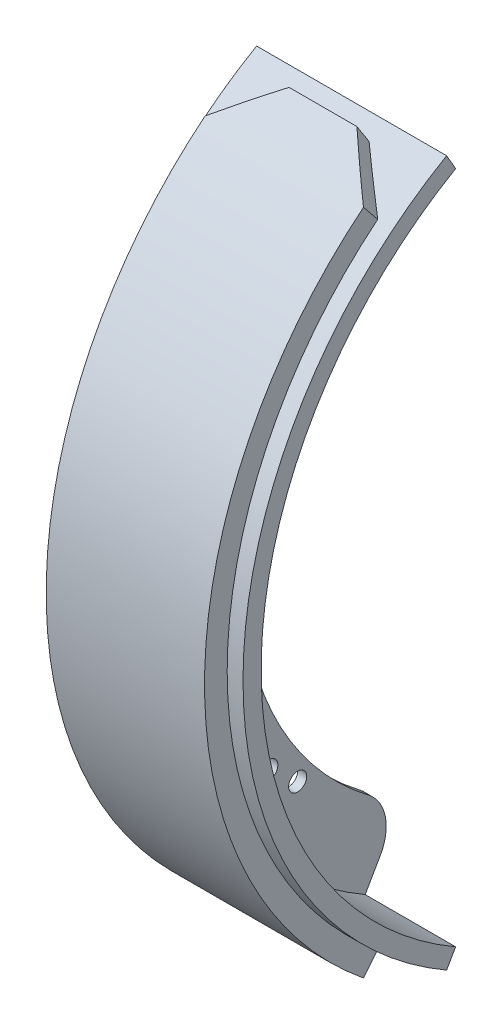
ISO-10303-21;
HEADER;
FILE_DESCRIPTION(('STEP AP214'),'2;1');
FILE_NAME('part.step','',(''),(''),'','','');
FILE_SCHEMA(('AUTOMOTIVE_DESIGN { 1 0 10303 214 1 1 1 1 }'));
ENDSEC;
DATA;
#1=APPLICATION_CONTEXT('core data for automotive mechanical design processes');
#2=APPLICATION_PROTOCOL_DEFINITION('international standard','automotive_design',2000,#1);
#3=PRODUCT_CONTEXT('',#1,'mechanical');
#4=PRODUCT('Part','Part','',(#3));
#5=PRODUCT_RELATED_PRODUCT_CATEGORY('part','',(#4));
#6=PRODUCT_DEFINITION_FORMATION('','',#4);
#7=PRODUCT_DEFINITION_CONTEXT('part definition',#1,'design');
#8=PRODUCT_DEFINITION('design','',#6,#7);
#9=PRODUCT_DEFINITION_SHAPE('','',#8);
#10=(LENGTH_UNIT() NAMED_UNIT(*) SI_UNIT(.MILLI.,.METRE.));
#11=(NAMED_UNIT(*) PLANE_ANGLE_UNIT() SI_UNIT($,.RADIAN.));
#12=(NAMED_UNIT(*) SI_UNIT($,.STERADIAN.) SOLID_ANGLE_UNIT());
#13=UNCERTAINTY_MEASURE_WITH_UNIT(LENGTH_MEASURE(1.E-05),#10,'distance_accuracy_value','');
#14=(GEOMETRIC_REPRESENTATION_CONTEXT(3) GLOBAL_UNCERTAINTY_ASSIGNED_CONTEXT((#13)) GLOBAL_UNIT_ASSIGNED_CONTEXT((#10,
#11,#12)) REPRESENTATION_CONTEXT('',''));
#15=CARTESIAN_POINT('',(0.,0.,0.));
#16=DIRECTION('',(0.,0.,1.));
#17=DIRECTION('',(1.,0.,0.));
#18=AXIS2_PLACEMENT_3D('',#15,#16,#17);
#19=CARTESIAN_POINT('',(1.,0.,0.));
#20=DIRECTION('',(1.,0.,0.));
#21=DIRECTION('',(0.,0.,-1.));
#22=AXIS2_PLACEMENT_3D('',#19,#20,#21);
#23=PLANE('',#22);
#24=CARTESIAN_POINT('',(1.,-40.0261742823472,64.3282642313976));
#25=DIRECTION('',(1.,0.,0.));
#26=DIRECTION('',(0.,0.,1.));
#27=AXIS2_PLACEMENT_3D('',#24,#25,#26);
#28=CIRCLE('',#27,2.02398586325188);
#29=CARTESIAN_POINT('',(1.,-42.0501601455991,64.3282642313976));
#30=VERTEX_POINT('',#29);
#31=CARTESIAN_POINT('',(1.,-38.0021884190953,64.3282642313976));
#32=VERTEX_POINT('',#31);
#33=EDGE_CURVE('E241',#30,#32,#28,.T.);
#34=ORIENTED_EDGE('',*,*,#33,.F.);
#35=DIRECTION('',(0.,0.,-1.));
#36=VECTOR('',#35,1.);
#37=CARTESIAN_POINT('',(1.,-42.0501601455991,70.3282642313976));
#38=LINE('',#37,#36);
#39=CARTESIAN_POINT('',(1.,-42.0501601455991,70.3282642313976));
#40=VERTEX_POINT('',#39);
#41=EDGE_CURVE('E245',#40,#30,#38,.T.);
#42=ORIENTED_EDGE('',*,*,#41,.F.);
#43=CARTESIAN_POINT('',(1.,-40.0261742823472,70.3282642313976));
#44=DIRECTION('',(1.,0.,0.));
#45=DIRECTION('',(0.,0.,-1.));
#46=AXIS2_PLACEMENT_3D('',#43,#44,#45);
#47=CIRCLE('',#46,2.02398586325188);
#48=CARTESIAN_POINT('',(1.,-38.0021884190953,70.3282642313976));
#49=VERTEX_POINT('',#48);
#50=EDGE_CURVE('E225',#49,#40,#47,.T.);
#51=ORIENTED_EDGE('',*,*,#50,.F.);
#52=DIRECTION('',(0.,0.,1.));
#53=VECTOR('',#52,1.);
#54=CARTESIAN_POINT('',(1.,-38.0021884190953,70.3282642313976));
#55=LINE('',#54,#53);
#56=EDGE_CURVE('E236',#32,#49,#55,.T.);
#57=ORIENTED_EDGE('',*,*,#56,.F.);
#58=EDGE_LOOP('',(#34,#42,#51,#57));
#59=FACE_BOUND('',#58,.T.);
#60=CARTESIAN_POINT('',(1.,-45.3747886598545,57.9188348109935));
#61=DIRECTION('',(1.,0.,0.));
#62=DIRECTION('',(0.,0.,-1.));
#63=AXIS2_PLACEMENT_3D('',#60,#61,#62);
#64=CIRCLE('',#63,2.);
#65=CARTESIAN_POINT('',(1.,-45.3747886598545,55.9188348109935));
#66=VERTEX_POINT('',#65);
#67=EDGE_CURVE('E255',#66,#66,#64,.T.);
#68=ORIENTED_EDGE('',*,*,#67,.F.);
#69=EDGE_LOOP('',(#68));
#70=FACE_BOUND('',#69,.T.);
#71=CARTESIAN_POINT('',(1.,67.5512987002253,43.9326505012517));
#72=DIRECTION('',(1.,0.,0.));
#73=DIRECTION('',(0.,0.,-1.));
#74=AXIS2_PLACEMENT_3D('',#71,#72,#73);
#75=CIRCLE('',#74,2.);
#76=CARTESIAN_POINT('',(1.,67.5512987002253,41.9326505012517));
#77=VERTEX_POINT('',#76);
#78=EDGE_CURVE('E258',#77,#77,#75,.T.);
#79=ORIENTED_EDGE('',*,*,#78,.F.);
#80=EDGE_LOOP('',(#79));
#81=FACE_BOUND('',#80,.T.);
#82=DIRECTION('',(0.,0.866025403784441,-0.499999999999995));
#83=VECTOR('',#82,1.);
#84=CARTESIAN_POINT('',(1.,-60.6217782649109,34.9999999999997));
#85=LINE('',#84,#83);
#86=CARTESIAN_POINT('',(1.,-74.4781847254619,42.9999999999996));
#87=VERTEX_POINT('',#86);
#88=CARTESIAN_POINT('',(1.,-68.7386354243378,39.6862696659685));
#89=VERTEX_POINT('',#88);
#90=EDGE_CURVE('E692',#87,#89,#85,.T.);
#91=ORIENTED_EDGE('',*,*,#90,.T.);
#92=CARTESIAN_POINT('',(1.,-63.7386354243379,48.3465237038129));
#93=DIRECTION('',(1.,0.,0.));
#94=DIRECTION('',(0.,0.,-1.));
#95=AXIS2_PLACEMENT_3D('',#92,#93,#94);
#96=CIRCLE('',#95,10.);
#97=CARTESIAN_POINT('',(1.,-55.7713059962956,42.3032082408363));
#98=VERTEX_POINT('',#97);
#99=EDGE_CURVE('E12',#89,#98,#96,.T.);
#100=ORIENTED_EDGE('',*,*,#99,.T.);
#101=CARTESIAN_POINT('',(1.,0.,0.));
#102=DIRECTION('',(-1.,0.,0.));
#103=DIRECTION('',(0.,0.,-1.));
#104=AXIS2_PLACEMENT_3D('',#101,#102,#103);
#105=CIRCLE('',#104,70.);
#106=CARTESIAN_POINT('',(1.,55.7713059962956,42.3032082408363));
#107=VERTEX_POINT('',#106);
#108=EDGE_CURVE('E687',#98,#107,#105,.T.);
#109=ORIENTED_EDGE('',*,*,#108,.T.);
#110=CARTESIAN_POINT('',(1.,63.7386354243378,48.3465237038129));
#111=DIRECTION('',(1.,0.,0.));
#112=DIRECTION('',(0.,0.,-1.));
#113=AXIS2_PLACEMENT_3D('',#110,#111,#112);
#114=CIRCLE('',#113,10.);
#115=CARTESIAN_POINT('',(1.,68.7386354243378,39.6862696659685));
#116=VERTEX_POINT('',#115);
#117=EDGE_CURVE('E780',#107,#116,#114,.T.);
#118=ORIENTED_EDGE('',*,*,#117,.T.);
#119=DIRECTION('',(0.,0.866025403784441,0.499999999999996));
#120=VECTOR('',#119,1.);
#121=CARTESIAN_POINT('',(1.,60.6217782649109,34.9999999999997));
#122=LINE('',#121,#120);
#123=CARTESIAN_POINT('',(1.,74.4781847254619,42.9999999999996));
#124=VERTEX_POINT('',#123);
#125=EDGE_CURVE('E689',#116,#124,#122,.T.);
#126=ORIENTED_EDGE('',*,*,#125,.T.);
#127=CARTESIAN_POINT('',(1.,0.,0.));
#128=DIRECTION('',(1.,0.,0.));
#129=DIRECTION('',(0.,0.,-1.));
#130=AXIS2_PLACEMENT_3D('',#127,#128,#129);
#131=CIRCLE('',#130,86.);
#132=EDGE_CURVE('E684',#124,#87,#131,.T.);
#133=ORIENTED_EDGE('',*,*,#132,.T.);
#134=EDGE_LOOP('',(#91,#100,#109,#118,#126,#133));
#135=FACE_BOUND('',#134,.T.);
#136=ADVANCED_FACE('F71',(#59,#70,#81,#135),#23,.T.);
#137=CARTESIAN_POINT('',(-1.,0.,0.));
#138=DIRECTION('',(1.,0.,0.));
#139=DIRECTION('',(0.,0.,-1.));
#140=AXIS2_PLACEMENT_3D('',#137,#138,#139);
#141=PLANE('',#140);
#142=DIRECTION('',(0.,0.,-1.));
#143=VECTOR('',#142,1.);
#144=CARTESIAN_POINT('',(-1.,-42.0501601455991,0.));
#145=LINE('',#144,#143);
#146=CARTESIAN_POINT('',(-1.,-42.0501601455991,70.3282642313976));
#147=VERTEX_POINT('',#146);
#148=CARTESIAN_POINT('',(-1.,-42.0501601455991,64.3282642313976));
#149=VERTEX_POINT('',#148);
#150=EDGE_CURVE('E765',#147,#149,#145,.T.);
#151=ORIENTED_EDGE('',*,*,#150,.T.);
#152=CARTESIAN_POINT('',(-1.,-40.0261742823472,64.3282642313976));
#153=DIRECTION('',(1.,0.,0.));
#154=DIRECTION('',(0.,0.,-1.));
#155=AXIS2_PLACEMENT_3D('',#152,#153,#154);
#156=CIRCLE('',#155,2.02398586325188);
#157=CARTESIAN_POINT('',(-1.,-38.0021884190953,64.3282642313976));
#158=VERTEX_POINT('',#157);
#159=EDGE_CURVE('E768',#149,#158,#156,.T.);
#160=ORIENTED_EDGE('',*,*,#159,.T.);
#161=DIRECTION('',(0.,0.,1.));
#162=VECTOR('',#161,1.);
#163=CARTESIAN_POINT('',(-1.,-38.0021884190954,0.));
#164=LINE('',#163,#162);
#165=CARTESIAN_POINT('',(-1.,-38.0021884190953,70.3282642313976));
#166=VERTEX_POINT('',#165);
#167=EDGE_CURVE('E703',#158,#166,#164,.T.);
#168=ORIENTED_EDGE('',*,*,#167,.T.);
#169=CARTESIAN_POINT('',(-1.,-40.0261742823472,70.3282642313976));
#170=DIRECTION('',(1.,0.,0.));
#171=DIRECTION('',(0.,0.,-1.));
#172=AXIS2_PLACEMENT_3D('',#169,#170,#171);
#173=CIRCLE('',#172,2.02398586325188);
#174=EDGE_CURVE('E228',#166,#147,#173,.T.);
#175=ORIENTED_EDGE('',*,*,#174,.T.);
#176=EDGE_LOOP('',(#151,#160,#168,#175));
#177=FACE_BOUND('',#176,.T.);
#178=CARTESIAN_POINT('',(-1.,-45.3747886598545,57.9188348109935));
#179=DIRECTION('',(1.,0.,0.));
#180=DIRECTION('',(0.,0.,-1.));
#181=AXIS2_PLACEMENT_3D('',#178,#179,#180);
#182=CIRCLE('',#181,2.);
#183=CARTESIAN_POINT('',(-1.,-45.3747886598545,55.9188348109935));
#184=VERTEX_POINT('',#183);
#185=EDGE_CURVE('E266',#184,#184,#182,.T.);
#186=ORIENTED_EDGE('',*,*,#185,.T.);
#187=EDGE_LOOP('',(#186));
#188=FACE_BOUND('',#187,.T.);
#189=CARTESIAN_POINT('',(-1.,67.5512987002253,43.9326505012517));
#190=DIRECTION('',(1.,0.,0.));
#191=DIRECTION('',(0.,0.,-1.));
#192=AXIS2_PLACEMENT_3D('',#189,#190,#191);
#193=CIRCLE('',#192,2.);
#194=CARTESIAN_POINT('',(-1.,67.5512987002253,41.9326505012517));
#195=VERTEX_POINT('',#194);
#196=EDGE_CURVE('E252',#195,#195,#193,.T.);
#197=ORIENTED_EDGE('',*,*,#196,.T.);
#198=EDGE_LOOP('',(#197));
#199=FACE_BOUND('',#198,.T.);
#200=CARTESIAN_POINT('',(-1.,0.,0.));
#201=DIRECTION('',(-1.,0.,0.));
#202=DIRECTION('',(0.,0.,-1.));
#203=AXIS2_PLACEMENT_3D('',#200,#201,#202);
#204=CIRCLE('',#203,70.);
#205=CARTESIAN_POINT('',(-1.,-55.7713059962956,42.3032082408363));
#206=VERTEX_POINT('',#205);
#207=CARTESIAN_POINT('',(-1.,55.7713059962956,42.3032082408363));
#208=VERTEX_POINT('',#207);
#209=EDGE_CURVE('E686',#206,#208,#204,.T.);
#210=ORIENTED_EDGE('',*,*,#209,.F.);
#211=CARTESIAN_POINT('',(-1.,-63.7386354243379,48.3465237038129));
#212=DIRECTION('',(1.,0.,0.));
#213=DIRECTION('',(0.,0.,-1.));
#214=AXIS2_PLACEMENT_3D('',#211,#212,#213);
#215=CIRCLE('',#214,10.);
#216=CARTESIAN_POINT('',(-1.,-68.7386354243378,39.6862696659685));
#217=VERTEX_POINT('',#216);
#218=EDGE_CURVE('E93',#206,#217,#215,.F.);
#219=ORIENTED_EDGE('',*,*,#218,.T.);
#220=DIRECTION('',(0.,0.866025403784441,-0.499999999999995));
#221=VECTOR('',#220,1.);
#222=CARTESIAN_POINT('',(-1.,-60.6217782649109,34.9999999999997));
#223=LINE('',#222,#221);
#224=CARTESIAN_POINT('',(-0.999999999999994,-74.4781847254619,42.9999999999996));
#225=VERTEX_POINT('',#224);
#226=EDGE_CURVE('E690',#225,#217,#223,.T.);
#227=ORIENTED_EDGE('',*,*,#226,.F.);
#228=CARTESIAN_POINT('',(-1.,0.,0.));
#229=DIRECTION('',(1.,0.,0.));
#230=DIRECTION('',(0.,0.,-1.));
#231=AXIS2_PLACEMENT_3D('',#228,#229,#230);
#232=CIRCLE('',#231,86.);
#233=CARTESIAN_POINT('',(-0.999999999999994,74.4781847254619,42.9999999999997));
#234=VERTEX_POINT('',#233);
#235=EDGE_CURVE('E702',#234,#225,#232,.T.);
#236=ORIENTED_EDGE('',*,*,#235,.F.);
#237=DIRECTION('',(0.,0.866025403784441,0.499999999999996));
#238=VECTOR('',#237,1.);
#239=CARTESIAN_POINT('',(-1.,60.6217782649109,34.9999999999997));
#240=LINE('',#239,#238);
#241=CARTESIAN_POINT('',(-1.,68.7386354243378,39.6862696659685));
#242=VERTEX_POINT('',#241);
#243=EDGE_CURVE('E696',#242,#234,#240,.T.);
#244=ORIENTED_EDGE('',*,*,#243,.F.);
#245=CARTESIAN_POINT('',(-1.,63.7386354243378,48.3465237038129));
#246=DIRECTION('',(1.,0.,0.));
#247=DIRECTION('',(0.,0.,-1.));
#248=AXIS2_PLACEMENT_3D('',#245,#246,#247);
#249=CIRCLE('',#248,10.);
#250=EDGE_CURVE('E774',#242,#208,#249,.F.);
#251=ORIENTED_EDGE('',*,*,#250,.T.);
#252=EDGE_LOOP('',(#210,#219,#227,#236,#244,#251));
#253=FACE_BOUND('',#252,.T.);
#254=ADVANCED_FACE('F791',(#177,#188,#199,#253),#141,.F.);
#255=CARTESIAN_POINT('',(1.,0.,0.));
#256=DIRECTION('',(-1.,0.,0.));
#257=DIRECTION('',(0.,0.,1.));
#258=AXIS2_PLACEMENT_3D('',#255,#256,#257);
#259=CYLINDRICAL_SURFACE('',#258,70.);
#260=ORIENTED_EDGE('',*,*,#108,.F.);
#261=DIRECTION('',(-1.,0.,0.));
#262=VECTOR('',#261,1.);
#263=CARTESIAN_POINT('',(1.,-55.7713059962956,42.3032082408363));
#264=LINE('',#263,#262);
#265=EDGE_CURVE('E782',#98,#206,#264,.T.);
#266=ORIENTED_EDGE('',*,*,#265,.T.);
#267=ORIENTED_EDGE('',*,*,#209,.T.);
#268=DIRECTION('',(-1.,0.,0.));
#269=VECTOR('',#268,1.);
#270=CARTESIAN_POINT('',(1.,55.7713059962956,42.3032082408363));
#271=LINE('',#270,#269);
#272=EDGE_CURVE('E777',#208,#107,#271,.F.);
#273=ORIENTED_EDGE('',*,*,#272,.T.);
#274=EDGE_LOOP('',(#260,#266,#267,#273));
#275=FACE_BOUND('',#274,.T.);
#276=ADVANCED_FACE('F788',(#275),#259,.F.);
#277=CARTESIAN_POINT('',(1.,60.6217782649109,34.9999999999997));
#278=DIRECTION('',(0.,-0.499999999999996,0.866025403784441));
#279=DIRECTION('',(0.,-0.866025403784441,-0.499999999999996));
#280=AXIS2_PLACEMENT_3D('',#277,#278,#279);
#281=PLANE('',#280);
#282=ORIENTED_EDGE('',*,*,#125,.F.);
#283=DIRECTION('',(-1.,0.,0.));
#284=VECTOR('',#283,1.);
#285=CARTESIAN_POINT('',(1.,68.7386354243378,39.6862696659685));
#286=LINE('',#285,#284);
#287=EDGE_CURVE('E771',#116,#242,#286,.T.);
#288=ORIENTED_EDGE('',*,*,#287,.T.);
#289=ORIENTED_EDGE('',*,*,#243,.T.);
#290=DIRECTION('',(-1.,0.,0.));
#291=VECTOR('',#290,1.);
#292=CARTESIAN_POINT('',(21.,74.4781847254619,42.9999999999997));
#293=LINE('',#292,#291);
#294=CARTESIAN_POINT('',(-21.,74.4781847254619,42.9999999999997));
#295=VERTEX_POINT('',#294);
#296=EDGE_CURVE('E680',#234,#295,#293,.T.);
#297=ORIENTED_EDGE('',*,*,#296,.T.);
#298=DIRECTION('',(0.,0.866025403784441,0.499999999999996));
#299=VECTOR('',#298,1.);
#300=CARTESIAN_POINT('',(-21.,74.4781847254619,42.9999999999996));
#301=LINE('',#300,#299);
#302=CARTESIAN_POINT('',(-21.,77.9422863405997,44.9999999999996));
#303=VERTEX_POINT('',#302);
#304=EDGE_CURVE('E672',#295,#303,#301,.T.);
#305=ORIENTED_EDGE('',*,*,#304,.T.);
#306=DIRECTION('',(-1.,0.,0.));
#307=VECTOR('',#306,1.);
#308=CARTESIAN_POINT('',(1.,77.9422863405997,44.9999999999996));
#309=LINE('',#308,#307);
#310=CARTESIAN_POINT('',(21.,77.9422863405997,44.9999999999996));
#311=VERTEX_POINT('',#310);
#312=EDGE_CURVE('E700',#311,#303,#309,.T.);
#313=ORIENTED_EDGE('',*,*,#312,.F.);
#314=DIRECTION('',(0.,0.866025403784441,0.499999999999996));
#315=VECTOR('',#314,1.);
#316=CARTESIAN_POINT('',(21.,74.4781847254619,42.9999999999996));
#317=LINE('',#316,#315);
#318=CARTESIAN_POINT('',(21.,74.4781847254619,42.9999999999997));
#319=VERTEX_POINT('',#318);
#320=EDGE_CURVE('E667',#319,#311,#317,.T.);
#321=ORIENTED_EDGE('',*,*,#320,.F.);
#322=EDGE_CURVE('E676',#319,#124,#293,.T.);
#323=ORIENTED_EDGE('',*,*,#322,.T.);
#324=EDGE_LOOP('',(#282,#288,#289,#297,#305,#313,#321,#323));
#325=FACE_BOUND('',#324,.T.);
#326=ADVANCED_FACE('F719',(#325),#281,.F.);
#327=CARTESIAN_POINT('',(1.,0.,0.));
#328=DIRECTION('',(-1.,0.,0.));
#329=DIRECTION('',(0.,0.,1.));
#330=AXIS2_PLACEMENT_3D('',#327,#328,#329);
#331=CYLINDRICAL_SURFACE('',#330,90.);
#332=CARTESIAN_POINT('',(-7.5,75.7323886327107,48.6272075281326));
#333=CARTESIAN_POINT('',(-10.8333410608964,73.9313767712634,51.4321173133457));
#334=CARTESIAN_POINT('',(-14.1666589391036,71.9743946239595,54.1368421792666));
#335=CARTESIAN_POINT('',(-17.5,69.8734729170595,56.7247545830651));
#336=B_SPLINE_CURVE_WITH_KNOTS('',3,(#332,#333,#334,#335),.UNSPECIFIED.,.F.,.F.,(4,4),(0.,1.),.UNSPECIFIED.);
#337=CARTESIAN_POINT('',(-7.5,75.7323886327107,48.6272075281326));
#338=VERTEX_POINT('',#337);
#339=CARTESIAN_POINT('',(-17.5,69.8734729170595,56.7247545830651));
#340=VERTEX_POINT('',#339);
#341=EDGE_CURVE('E518',#338,#340,#336,.T.);
#342=ORIENTED_EDGE('',*,*,#341,.F.);
#343=DIRECTION('',(-1.,0.,0.));
#344=VECTOR('',#343,1.);
#345=CARTESIAN_POINT('',(7.5,75.7323886327107,48.6272075281326));
#346=LINE('',#345,#344);
#347=CARTESIAN_POINT('',(7.5,75.7323886327107,48.6272075281326));
#348=VERTEX_POINT('',#347);
#349=EDGE_CURVE('E311',#348,#338,#346,.T.);
#350=ORIENTED_EDGE('',*,*,#349,.F.);
#351=CARTESIAN_POINT('',(17.5,69.8734729170595,56.7247545830651));
#352=CARTESIAN_POINT('',(14.1666589391036,71.9743946239595,54.1368421792666));
#353=CARTESIAN_POINT('',(10.8333410608964,73.9313767712634,51.4321173133457));
#354=CARTESIAN_POINT('',(7.5,75.7323886327107,48.6272075281326));
#355=B_SPLINE_CURVE_WITH_KNOTS('',3,(#351,#352,#353,#354),.UNSPECIFIED.,.F.,.F.,(4,4),(0.,1.),.UNSPECIFIED.);
#356=CARTESIAN_POINT('',(17.5,69.8734729170595,56.7247545830651));
#357=VERTEX_POINT('',#356);
#358=EDGE_CURVE('E336',#357,#348,#355,.T.);
#359=ORIENTED_EDGE('',*,*,#358,.F.);
#360=CARTESIAN_POINT('',(17.5,0.,0.));
#361=DIRECTION('',(-1.,0.,0.));
#362=DIRECTION('',(0.,0.776371921300661,0.630275050922945));
#363=AXIS2_PLACEMENT_3D('',#360,#361,#362);
#364=CIRCLE('',#363,90.);
#365=CARTESIAN_POINT('',(17.5,-69.8734729170594,56.7247545830651));
#366=VERTEX_POINT('',#365);
#367=EDGE_CURVE('E552',#366,#357,#364,.T.);
#368=ORIENTED_EDGE('',*,*,#367,.F.);
#369=CARTESIAN_POINT('',(7.5,-75.7323886327107,48.6272075281326));
#370=CARTESIAN_POINT('',(10.8333410608964,-73.9313767712634,51.4321173133457));
#371=CARTESIAN_POINT('',(14.1666589391036,-71.9743946239595,54.1368421792665));
#372=CARTESIAN_POINT('',(17.5,-69.8734729170594,56.7247545830651));
#373=B_SPLINE_CURVE_WITH_KNOTS('',3,(#369,#370,#371,#372),.UNSPECIFIED.,.F.,.F.,(4,4),(0.,1.),.UNSPECIFIED.);
#374=CARTESIAN_POINT('',(7.49999999999999,-75.7323886327107,48.6272075281326));
#375=VERTEX_POINT('',#374);
#376=EDGE_CURVE('E544',#375,#366,#373,.T.);
#377=ORIENTED_EDGE('',*,*,#376,.F.);
#378=DIRECTION('',(1.,0.,0.));
#379=VECTOR('',#378,1.);
#380=CARTESIAN_POINT('',(-7.5,-75.7323886327107,48.6272075281326));
#381=LINE('',#380,#379);
#382=CARTESIAN_POINT('',(-7.5,-75.7323886327107,48.6272075281326));
#383=VERTEX_POINT('',#382);
#384=EDGE_CURVE('E537',#383,#375,#381,.T.);
#385=ORIENTED_EDGE('',*,*,#384,.F.);
#386=CARTESIAN_POINT('',(-17.5,-69.8734729170594,56.7247545830651));
#387=CARTESIAN_POINT('',(-14.1666589391036,-71.9743946239595,54.1368421792666));
#388=CARTESIAN_POINT('',(-10.8333410608964,-73.9313767712634,51.4321173133456));
#389=CARTESIAN_POINT('',(-7.5,-75.7323886327107,48.6272075281326));
#390=B_SPLINE_CURVE_WITH_KNOTS('',3,(#386,#387,#388,#389),.UNSPECIFIED.,.F.,.F.,(4,4),(0.,1.),.UNSPECIFIED.);
#391=CARTESIAN_POINT('',(-17.5,-69.8734729170594,56.7247545830651));
#392=VERTEX_POINT('',#391);
#393=EDGE_CURVE('E531',#392,#383,#390,.T.);
#394=ORIENTED_EDGE('',*,*,#393,.F.);
#395=CARTESIAN_POINT('',(-17.5,0.,0.));
#396=DIRECTION('',(-1.,0.,0.));
#397=DIRECTION('',(0.,0.776371921300661,0.630275050922945));
#398=AXIS2_PLACEMENT_3D('',#395,#396,#397);
#399=CIRCLE('',#398,90.);
#400=EDGE_CURVE('E273',#392,#340,#399,.T.);
#401=ORIENTED_EDGE('',*,*,#400,.T.);
#402=EDGE_LOOP('',(#342,#350,#359,#368,#377,#385,#394,#401));
#403=FACE_BOUND('',#402,.T.);
#404=ORIENTED_EDGE('',*,*,#312,.T.);
#405=CARTESIAN_POINT('',(-21.,0.,0.));
#406=DIRECTION('',(1.,0.,0.));
#407=DIRECTION('',(0.,0.,-1.));
#408=AXIS2_PLACEMENT_3D('',#405,#406,#407);
#409=CIRCLE('',#408,90.);
#410=CARTESIAN_POINT('',(-21.,-77.9422863405997,44.9999999999996));
#411=VERTEX_POINT('',#410);
#412=EDGE_CURVE('E658',#303,#411,#409,.T.);
#413=ORIENTED_EDGE('',*,*,#412,.T.);
#414=DIRECTION('',(-1.,0.,0.));
#415=VECTOR('',#414,1.);
#416=CARTESIAN_POINT('',(1.,-77.9422863405997,44.9999999999996));
#417=LINE('',#416,#415);
#418=CARTESIAN_POINT('',(21.,-77.9422863405997,44.9999999999996));
#419=VERTEX_POINT('',#418);
#420=EDGE_CURVE('E694',#419,#411,#417,.T.);
#421=ORIENTED_EDGE('',*,*,#420,.F.);
#422=CARTESIAN_POINT('',(21.,0.,0.));
#423=DIRECTION('',(1.,0.,0.));
#424=DIRECTION('',(0.,0.,-1.));
#425=AXIS2_PLACEMENT_3D('',#422,#423,#424);
#426=CIRCLE('',#425,90.);
#427=EDGE_CURVE('E675',#311,#419,#426,.T.);
#428=ORIENTED_EDGE('',*,*,#427,.F.);
#429=EDGE_LOOP('',(#404,#413,#421,#428));
#430=FACE_BOUND('',#429,.T.);
#431=ADVANCED_FACE('F540',(#403,#430),#331,.T.);
#432=CARTESIAN_POINT('',(1.,-60.6217782649109,34.9999999999997));
#433=DIRECTION('',(0.,0.499999999999995,0.866025403784441));
#434=DIRECTION('',(0.,-0.866025403784441,0.499999999999995));
#435=AXIS2_PLACEMENT_3D('',#432,#433,#434);
#436=PLANE('',#435);
#437=ORIENTED_EDGE('',*,*,#226,.T.);
#438=DIRECTION('',(-1.,0.,0.));
#439=VECTOR('',#438,1.);
#440=CARTESIAN_POINT('',(1.,-68.7386354243378,39.6862696659685));
#441=LINE('',#440,#439);
#442=EDGE_CURVE('E79',#217,#89,#441,.F.);
#443=ORIENTED_EDGE('',*,*,#442,.T.);
#444=ORIENTED_EDGE('',*,*,#90,.F.);
#445=DIRECTION('',(-1.,0.,0.));
#446=VECTOR('',#445,1.);
#447=CARTESIAN_POINT('',(21.,-74.4781847254619,42.9999999999996));
#448=LINE('',#447,#446);
#449=CARTESIAN_POINT('',(21.,-74.4781847254619,42.9999999999996));
#450=VERTEX_POINT('',#449);
#451=EDGE_CURVE('E681',#450,#87,#448,.T.);
#452=ORIENTED_EDGE('',*,*,#451,.F.);
#453=DIRECTION('',(0.,0.866025403784442,-0.499999999999993));
#454=VECTOR('',#453,1.);
#455=CARTESIAN_POINT('',(21.,-77.9422863405997,44.9999999999996));
#456=LINE('',#455,#454);
#457=EDGE_CURVE('E812',#419,#450,#456,.T.);
#458=ORIENTED_EDGE('',*,*,#457,.F.);
#459=ORIENTED_EDGE('',*,*,#420,.T.);
#460=DIRECTION('',(0.,0.866025403784442,-0.499999999999993));
#461=VECTOR('',#460,1.);
#462=CARTESIAN_POINT('',(-21.,-77.9422863405997,44.9999999999996));
#463=LINE('',#462,#461);
#464=CARTESIAN_POINT('',(-21.,-74.4781847254619,42.9999999999996));
#465=VERTEX_POINT('',#464);
#466=EDGE_CURVE('E660',#411,#465,#463,.T.);
#467=ORIENTED_EDGE('',*,*,#466,.T.);
#468=EDGE_CURVE('E679',#225,#465,#448,.T.);
#469=ORIENTED_EDGE('',*,*,#468,.F.);
#470=EDGE_LOOP('',(#437,#443,#444,#452,#458,#459,#467,#469));
#471=FACE_BOUND('',#470,.T.);
#472=ADVANCED_FACE('F718',(#471),#436,.F.);
#473=CARTESIAN_POINT('',(-21.,0.,0.));
#474=DIRECTION('',(1.,0.,0.));
#475=DIRECTION('',(0.,0.,-1.));
#476=AXIS2_PLACEMENT_3D('',#473,#474,#475);
#477=PLANE('',#476);
#478=ORIENTED_EDGE('',*,*,#412,.F.);
#479=ORIENTED_EDGE('',*,*,#304,.F.);
#480=CARTESIAN_POINT('',(-21.,0.,0.));
#481=DIRECTION('',(-1.,0.,0.));
#482=DIRECTION('',(0.,0.,-1.));
#483=AXIS2_PLACEMENT_3D('',#480,#481,#482);
#484=CIRCLE('',#483,86.);
#485=EDGE_CURVE('E664',#465,#295,#484,.T.);
#486=ORIENTED_EDGE('',*,*,#485,.F.);
#487=ORIENTED_EDGE('',*,*,#466,.F.);
#488=EDGE_LOOP('',(#478,#479,#486,#487));
#489=FACE_BOUND('',#488,.T.);
#490=ADVANCED_FACE('F828',(#489),#477,.F.);
#491=CARTESIAN_POINT('',(21.,0.,0.));
#492=DIRECTION('',(-1.,0.,0.));
#493=DIRECTION('',(0.,0.,1.));
#494=AXIS2_PLACEMENT_3D('',#491,#492,#493);
#495=CYLINDRICAL_SURFACE('',#494,86.);
#496=ORIENTED_EDGE('',*,*,#296,.F.);
#497=ORIENTED_EDGE('',*,*,#235,.T.);
#498=ORIENTED_EDGE('',*,*,#468,.T.);
#499=ORIENTED_EDGE('',*,*,#485,.T.);
#500=EDGE_LOOP('',(#496,#497,#498,#499));
#501=FACE_BOUND('',#500,.T.);
#502=ADVANCED_FACE('F825',(#501),#495,.F.);
#503=ORIENTED_EDGE('',*,*,#132,.F.);
#504=ORIENTED_EDGE('',*,*,#322,.F.);
#505=CARTESIAN_POINT('',(21.,0.,0.));
#506=DIRECTION('',(-1.,0.,0.));
#507=DIRECTION('',(0.,0.,-1.));
#508=AXIS2_PLACEMENT_3D('',#505,#506,#507);
#509=CIRCLE('',#508,86.);
#510=EDGE_CURVE('E809',#450,#319,#509,.T.);
#511=ORIENTED_EDGE('',*,*,#510,.F.);
#512=ORIENTED_EDGE('',*,*,#451,.T.);
#513=EDGE_LOOP('',(#503,#504,#511,#512));
#514=FACE_BOUND('',#513,.T.);
#515=ADVANCED_FACE('F808',(#514),#495,.F.);
#516=CARTESIAN_POINT('',(21.,0.,0.));
#517=DIRECTION('',(1.,0.,0.));
#518=DIRECTION('',(0.,0.,-1.));
#519=AXIS2_PLACEMENT_3D('',#516,#517,#518);
#520=PLANE('',#519);
#521=ORIENTED_EDGE('',*,*,#427,.T.);
#522=ORIENTED_EDGE('',*,*,#457,.T.);
#523=ORIENTED_EDGE('',*,*,#510,.T.);
#524=ORIENTED_EDGE('',*,*,#320,.T.);
#525=EDGE_LOOP('',(#521,#522,#523,#524));
#526=FACE_BOUND('',#525,.T.);
#527=ADVANCED_FACE('F435',(#526),#520,.T.);
#528=CARTESIAN_POINT('',(0.,75.7323886327107,48.6272075281326));
#529=DIRECTION('',(0.,0.54030230586814,-0.841470984807896));
#530=DIRECTION('',(-1.,0.,0.));
#531=AXIS2_PLACEMENT_3D('',#528,#529,#530);
#532=PLANE('',#531);
#533=CARTESIAN_POINT('',(-7.5,79.9397435567502,51.3287190574733));
#534=CARTESIAN_POINT('',(-7.5,75.7323886327107,48.6272075281326));
#535=B_SPLINE_CURVE_WITH_KNOTS('',1,(#533,#534),.UNSPECIFIED.,.F.,.F.,(2,2),(0.,1.),.UNSPECIFIED.);
#536=CARTESIAN_POINT('',(-7.5,79.9397435567502,51.3287190574733));
#537=VERTEX_POINT('',#536);
#538=EDGE_CURVE('E419',#537,#338,#535,.T.);
#539=ORIENTED_EDGE('',*,*,#538,.F.);
#540=DIRECTION('',(-1.,0.,0.));
#541=VECTOR('',#540,1.);
#542=CARTESIAN_POINT('',(1.,79.9397435567502,51.3287190574733));
#543=LINE('',#542,#541);
#544=CARTESIAN_POINT('',(7.5,79.9397435567502,51.3287190574733));
#545=VERTEX_POINT('',#544);
#546=EDGE_CURVE('E327',#545,#537,#543,.T.);
#547=ORIENTED_EDGE('',*,*,#546,.F.);
#548=CARTESIAN_POINT('',(7.5,75.7323886327107,48.6272075281326));
#549=CARTESIAN_POINT('',(7.5,79.9397435567502,51.3287190574733));
#550=B_SPLINE_CURVE_WITH_KNOTS('',1,(#548,#549),.UNSPECIFIED.,.F.,.F.,(2,2),(0.,1.),.UNSPECIFIED.);
#551=EDGE_CURVE('E397',#545,#348,#550,.F.);
#552=ORIENTED_EDGE('',*,*,#551,.T.);
#553=ORIENTED_EDGE('',*,*,#349,.T.);
#554=EDGE_LOOP('',(#539,#547,#552,#553));
#555=FACE_BOUND('',#554,.T.);
#556=ADVANCED_FACE('F356',(#555),#532,.T.);
#557=CARTESIAN_POINT('',(17.5,73.7553325235628,59.8761298376798));
#558=CARTESIAN_POINT('',(14.166658525755,75.9729723780652,57.1444441838184));
#559=CARTESIAN_POINT('',(10.833341474245,78.0386752450374,54.2894575312313));
#560=CARTESIAN_POINT('',(7.5,79.9397435567502,51.3287190574733));
#561=CARTESIAN_POINT('',(17.5,69.8734729170595,56.7247545830651));
#562=CARTESIAN_POINT('',(14.1666589391036,71.9743946239595,54.1368421792666));
#563=CARTESIAN_POINT('',(10.8333410608964,73.9313767712634,51.4321173133457));
#564=CARTESIAN_POINT('',(7.5,75.7323886327107,48.6272075281326));
#565=B_SPLINE_SURFACE_WITH_KNOTS('',1,3,((#557,#558,#559,#560),(#561,#562,#563,#564)),
.UNSPECIFIED.,.F.,.F.,.F.,(2,2),(4,4),(0.,1.),(0.,1.),.UNSPECIFIED.);
#566=CARTESIAN_POINT('',(7.5,79.9397435567502,51.3287190574733));
#567=CARTESIAN_POINT('',(10.833341474245,78.0386752450374,54.2894575312313));
#568=CARTESIAN_POINT('',(14.166658525755,75.9729723780652,57.1444441838184));
#569=CARTESIAN_POINT('',(17.5,73.7553325235628,59.8761298376798));
#570=B_SPLINE_CURVE_WITH_KNOTS('',3,(#566,#567,#568,#569),.UNSPECIFIED.,.F.,.F.,(4,4),(0.,1.),.UNSPECIFIED.);
#571=CARTESIAN_POINT('',(17.5,73.7553325235628,59.8761298376798));
#572=VERTEX_POINT('',#571);
#573=EDGE_CURVE('E324',#572,#545,#570,.F.);
#574=CARTESIAN_POINT('',(17.5,73.7553325235628,59.8761298376798));
#575=CARTESIAN_POINT('',(17.5,69.8734729170595,56.7247545830651));
#576=B_SPLINE_CURVE_WITH_KNOTS('',1,(#574,#575),.UNSPECIFIED.,.F.,.F.,(2,2),(0.,1.),.UNSPECIFIED.);
#577=EDGE_CURVE('E386',#572,#357,#576,.T.);
#578=ORIENTED_EDGE('',*,*,#551,.F.);
#579=ORIENTED_EDGE('',*,*,#573,.F.);
#580=ORIENTED_EDGE('',*,*,#577,.T.);
#581=ORIENTED_EDGE('',*,*,#358,.T.);
#582=EDGE_LOOP('',(#578,#579,#580,#581));
#583=FACE_BOUND('',#582,.T.);
#584=ADVANCED_FACE('F343',(#583),#565,.T.);
#585=CARTESIAN_POINT('',(17.5,0.,0.));
#586=DIRECTION('',(1.,0.,0.));
#587=DIRECTION('',(0.,0.,-1.));
#588=AXIS2_PLACEMENT_3D('',#585,#586,#587);
#589=PLANE('',#588);
#590=ORIENTED_EDGE('',*,*,#577,.F.);
#591=CARTESIAN_POINT('',(17.5,0.,0.));
#592=DIRECTION('',(-1.,0.,0.));
#593=DIRECTION('',(0.,0.,1.));
#594=AXIS2_PLACEMENT_3D('',#591,#592,#593);
#595=CIRCLE('',#594,95.);
#596=CARTESIAN_POINT('',(17.5,-73.7553325235627,59.8761298376798));
#597=VERTEX_POINT('',#596);
#598=EDGE_CURVE('E526',#597,#572,#595,.T.);
#599=ORIENTED_EDGE('',*,*,#598,.F.);
#600=CARTESIAN_POINT('',(17.5,-69.8734729170594,56.7247545830651));
#601=CARTESIAN_POINT('',(17.5,-73.7553325235627,59.8761298376798));
#602=B_SPLINE_CURVE_WITH_KNOTS('',1,(#600,#601),.UNSPECIFIED.,.F.,.F.,(2,2),(0.,1.),.UNSPECIFIED.);
#603=EDGE_CURVE('E612',#597,#366,#602,.F.);
#604=ORIENTED_EDGE('',*,*,#603,.T.);
#605=ORIENTED_EDGE('',*,*,#367,.T.);
#606=EDGE_LOOP('',(#590,#599,#604,#605));
#607=FACE_BOUND('',#606,.T.);
#608=ADVANCED_FACE('F355',(#607),#589,.T.);
#609=CARTESIAN_POINT('',(7.5,-79.9397435567502,51.3287190574733));
#610=CARTESIAN_POINT('',(10.833341474245,-78.0386752450375,54.2894575312313));
#611=CARTESIAN_POINT('',(14.166658525755,-75.9729723780652,57.1444441838184));
#612=CARTESIAN_POINT('',(17.5,-73.7553325235627,59.8761298376798));
#613=CARTESIAN_POINT('',(7.5,-75.7323886327107,48.6272075281326));
#614=CARTESIAN_POINT('',(10.8333410608964,-73.9313767712634,51.4321173133457));
#615=CARTESIAN_POINT('',(14.1666589391036,-71.9743946239595,54.1368421792665));
#616=CARTESIAN_POINT('',(17.5,-69.8734729170594,56.7247545830651));
#617=B_SPLINE_SURFACE_WITH_KNOTS('',1,3,((#609,#610,#611,#612),(#613,#614,#615,#616)),
.UNSPECIFIED.,.F.,.F.,.F.,(2,2),(4,4),(0.,1.),(0.,1.),.UNSPECIFIED.);
#618=CARTESIAN_POINT('',(17.5,-73.7553325235627,59.8761298376798));
#619=CARTESIAN_POINT('',(14.166658525755,-75.9729723780652,57.1444441838184));
#620=CARTESIAN_POINT('',(10.833341474245,-78.0386752450375,54.2894575312313));
#621=CARTESIAN_POINT('',(7.5,-79.9397435567502,51.3287190574733));
#622=B_SPLINE_CURVE_WITH_KNOTS('',3,(#618,#619,#620,#621),.UNSPECIFIED.,.F.,.F.,(4,4),(0.,1.),.UNSPECIFIED.);
#623=CARTESIAN_POINT('',(7.5,-79.9397435567502,51.3287190574733));
#624=VERTEX_POINT('',#623);
#625=EDGE_CURVE('E519',#624,#597,#622,.F.);
#626=CARTESIAN_POINT('',(7.5,-79.9397435567502,51.3287190574733));
#627=CARTESIAN_POINT('',(7.5,-75.7323886327107,48.6272075281326));
#628=B_SPLINE_CURVE_WITH_KNOTS('',1,(#626,#627),.UNSPECIFIED.,.F.,.F.,(2,2),(0.,1.),.UNSPECIFIED.);
#629=EDGE_CURVE('E602',#624,#375,#628,.T.);
#630=ORIENTED_EDGE('',*,*,#603,.F.);
#631=ORIENTED_EDGE('',*,*,#625,.F.);
#632=ORIENTED_EDGE('',*,*,#629,.T.);
#633=ORIENTED_EDGE('',*,*,#376,.T.);
#634=EDGE_LOOP('',(#630,#631,#632,#633));
#635=FACE_BOUND('',#634,.T.);
#636=ADVANCED_FACE('F573',(#635),#617,.T.);
#637=CARTESIAN_POINT('',(0.,-75.7323886327107,48.6272075281326));
#638=DIRECTION('',(0.,-0.54030230586814,-0.841470984807897));
#639=DIRECTION('',(1.,0.,0.));
#640=AXIS2_PLACEMENT_3D('',#637,#638,#639);
#641=PLANE('',#640);
#642=ORIENTED_EDGE('',*,*,#629,.F.);
#643=DIRECTION('',(-1.,0.,0.));
#644=VECTOR('',#643,1.);
#645=CARTESIAN_POINT('',(1.,-79.9397435567502,51.3287190574733));
#646=LINE('',#645,#644);
#647=CARTESIAN_POINT('',(-7.5,-79.9397435567502,51.3287190574733));
#648=VERTEX_POINT('',#647);
#649=EDGE_CURVE('E512',#648,#624,#646,.F.);
#650=ORIENTED_EDGE('',*,*,#649,.F.);
#651=CARTESIAN_POINT('',(-7.5,-75.7323886327107,48.6272075281326));
#652=CARTESIAN_POINT('',(-7.5,-79.9397435567502,51.3287190574733));
#653=B_SPLINE_CURVE_WITH_KNOTS('',1,(#651,#652),.UNSPECIFIED.,.F.,.F.,(2,2),(0.,1.),.UNSPECIFIED.);
#654=EDGE_CURVE('E506',#648,#383,#653,.F.);
#655=ORIENTED_EDGE('',*,*,#654,.T.);
#656=ORIENTED_EDGE('',*,*,#384,.T.);
#657=EDGE_LOOP('',(#642,#650,#655,#656));
#658=FACE_BOUND('',#657,.T.);
#659=ADVANCED_FACE('F481',(#658),#641,.T.);
#660=CARTESIAN_POINT('',(-17.5,-73.7553325235627,59.8761298376798));
#661=CARTESIAN_POINT('',(-14.166658525755,-75.9729723780652,57.1444441838184));
#662=CARTESIAN_POINT('',(-10.833341474245,-78.0386752450375,54.2894575312313));
#663=CARTESIAN_POINT('',(-7.5,-79.9397435567502,51.3287190574733));
#664=CARTESIAN_POINT('',(-17.5,-69.8734729170594,56.7247545830651));
#665=CARTESIAN_POINT('',(-14.1666589391036,-71.9743946239595,54.1368421792666));
#666=CARTESIAN_POINT('',(-10.8333410608964,-73.9313767712634,51.4321173133456));
#667=CARTESIAN_POINT('',(-7.5,-75.7323886327107,48.6272075281326));
#668=B_SPLINE_SURFACE_WITH_KNOTS('',1,3,((#660,#661,#662,#663),(#664,#665,#666,#667)),
.UNSPECIFIED.,.F.,.F.,.F.,(2,2),(4,4),(0.,1.),(0.,1.),.UNSPECIFIED.);
#669=CARTESIAN_POINT('',(-7.5,-79.9397435567502,51.3287190574733));
#670=CARTESIAN_POINT('',(-10.833341474245,-78.0386752450375,54.2894575312313));
#671=CARTESIAN_POINT('',(-14.166658525755,-75.9729723780652,57.1444441838184));
#672=CARTESIAN_POINT('',(-17.5,-73.7553325235627,59.8761298376798));
#673=B_SPLINE_CURVE_WITH_KNOTS('',3,(#669,#670,#671,#672),.UNSPECIFIED.,.F.,.F.,(4,4),(0.,1.),.UNSPECIFIED.);
#674=CARTESIAN_POINT('',(-17.5,-73.7553325235627,59.8761298376798));
#675=VERTEX_POINT('',#674);
#676=EDGE_CURVE('E505',#675,#648,#673,.F.);
#677=CARTESIAN_POINT('',(-17.5,-73.7553325235627,59.8761298376798));
#678=CARTESIAN_POINT('',(-17.5,-69.8734729170594,56.7247545830651));
#679=B_SPLINE_CURVE_WITH_KNOTS('',1,(#677,#678),.UNSPECIFIED.,.F.,.F.,(2,2),(0.,1.),.UNSPECIFIED.);
#680=EDGE_CURVE('E464',#675,#392,#679,.T.);
#681=ORIENTED_EDGE('',*,*,#654,.F.);
#682=ORIENTED_EDGE('',*,*,#676,.F.);
#683=ORIENTED_EDGE('',*,*,#680,.T.);
#684=ORIENTED_EDGE('',*,*,#393,.T.);
#685=EDGE_LOOP('',(#681,#682,#683,#684));
#686=FACE_BOUND('',#685,.T.);
#687=ADVANCED_FACE('F470',(#686),#668,.T.);
#688=CARTESIAN_POINT('',(-17.5,0.,0.));
#689=DIRECTION('',(1.,0.,0.));
#690=DIRECTION('',(0.,0.,-1.));
#691=AXIS2_PLACEMENT_3D('',#688,#689,#690);
#692=PLANE('',#691);
#693=ORIENTED_EDGE('',*,*,#680,.F.);
#694=CARTESIAN_POINT('',(-17.5,0.,0.));
#695=DIRECTION('',(-1.,0.,0.));
#696=DIRECTION('',(0.,0.,1.));
#697=AXIS2_PLACEMENT_3D('',#694,#695,#696);
#698=CIRCLE('',#697,95.);
#699=CARTESIAN_POINT('',(-17.5,73.7553325235628,59.8761298376798));
#700=VERTEX_POINT('',#699);
#701=EDGE_CURVE('E261',#675,#700,#698,.T.);
#702=ORIENTED_EDGE('',*,*,#701,.T.);
#703=CARTESIAN_POINT('',(-17.5,69.8734729170595,56.7247545830651));
#704=CARTESIAN_POINT('',(-17.5,73.7553325235628,59.8761298376798));
#705=B_SPLINE_CURVE_WITH_KNOTS('',1,(#703,#704),.UNSPECIFIED.,.F.,.F.,(2,2),(0.,1.),.UNSPECIFIED.);
#706=EDGE_CURVE('E536',#700,#340,#705,.F.);
#707=ORIENTED_EDGE('',*,*,#706,.T.);
#708=ORIENTED_EDGE('',*,*,#400,.F.);
#709=EDGE_LOOP('',(#693,#702,#707,#708));
#710=FACE_BOUND('',#709,.T.);
#711=ADVANCED_FACE('F290',(#710),#692,.F.);
#712=CARTESIAN_POINT('',(-7.5,79.9397435567502,51.3287190574733));
#713=CARTESIAN_POINT('',(-10.833341474245,78.0386752450375,54.2894575312313));
#714=CARTESIAN_POINT('',(-14.166658525755,75.9729723780652,57.1444441838184));
#715=CARTESIAN_POINT('',(-17.5,73.7553325235628,59.8761298376798));
#716=CARTESIAN_POINT('',(-7.5,75.7323886327107,48.6272075281326));
#717=CARTESIAN_POINT('',(-10.8333410608964,73.9313767712634,51.4321173133457));
#718=CARTESIAN_POINT('',(-14.1666589391036,71.9743946239595,54.1368421792666));
#719=CARTESIAN_POINT('',(-17.5,69.8734729170595,56.7247545830651));
#720=B_SPLINE_SURFACE_WITH_KNOTS('',1,3,((#712,#713,#714,#715),(#716,#717,#718,#719)),
.UNSPECIFIED.,.F.,.F.,.F.,(2,2),(4,4),(0.,1.),(0.,1.),.UNSPECIFIED.);
#721=CARTESIAN_POINT('',(-17.5,73.7553325235628,59.8761298376798));
#722=CARTESIAN_POINT('',(-14.166658525755,75.9729723780652,57.1444441838184));
#723=CARTESIAN_POINT('',(-10.833341474245,78.0386752450375,54.2894575312313));
#724=CARTESIAN_POINT('',(-7.5,79.9397435567502,51.3287190574733));
#725=B_SPLINE_CURVE_WITH_KNOTS('',3,(#721,#722,#723,#724),.UNSPECIFIED.,.F.,.F.,(4,4),(0.,1.),.UNSPECIFIED.);
#726=EDGE_CURVE('E265',#537,#700,#725,.F.);
#727=ORIENTED_EDGE('',*,*,#726,.F.);
#728=ORIENTED_EDGE('',*,*,#538,.T.);
#729=ORIENTED_EDGE('',*,*,#341,.T.);
#730=ORIENTED_EDGE('',*,*,#706,.F.);
#731=EDGE_LOOP('',(#727,#728,#729,#730));
#732=FACE_BOUND('',#731,.T.);
#733=ADVANCED_FACE('F287',(#732),#720,.T.);
#734=CARTESIAN_POINT('',(1.,0.,0.));
#735=DIRECTION('',(-1.,0.,0.));
#736=DIRECTION('',(0.,0.,1.));
#737=AXIS2_PLACEMENT_3D('',#734,#735,#736);
#738=CYLINDRICAL_SURFACE('',#737,95.);
#739=ORIENTED_EDGE('',*,*,#701,.F.);
#740=ORIENTED_EDGE('',*,*,#676,.T.);
#741=ORIENTED_EDGE('',*,*,#649,.T.);
#742=ORIENTED_EDGE('',*,*,#625,.T.);
#743=ORIENTED_EDGE('',*,*,#598,.T.);
#744=ORIENTED_EDGE('',*,*,#573,.T.);
#745=ORIENTED_EDGE('',*,*,#546,.T.);
#746=ORIENTED_EDGE('',*,*,#726,.T.);
#747=EDGE_LOOP('',(#739,#740,#741,#742,#743,#744,#745,#746));
#748=FACE_BOUND('',#747,.T.);
#749=ADVANCED_FACE('F276',(#748),#738,.T.);
#750=CARTESIAN_POINT('',(-9.,67.5512987002253,43.9326505012517));
#751=DIRECTION('',(1.,0.,0.));
#752=DIRECTION('',(0.,0.,-1.));
#753=AXIS2_PLACEMENT_3D('',#750,#751,#752);
#754=CYLINDRICAL_SURFACE('',#753,2.);
#755=ORIENTED_EDGE('',*,*,#78,.T.);
#756=EDGE_LOOP('',(#755));
#757=FACE_BOUND('',#756,.T.);
#758=ORIENTED_EDGE('',*,*,#196,.F.);
#759=EDGE_LOOP('',(#758));
#760=FACE_BOUND('',#759,.T.);
#761=ADVANCED_FACE('F286',(#757,#760),#754,.F.);
#762=CARTESIAN_POINT('',(-9.,-45.3747886598545,57.9188348109935));
#763=DIRECTION('',(1.,0.,0.));
#764=DIRECTION('',(0.,0.,-1.));
#765=AXIS2_PLACEMENT_3D('',#762,#763,#764);
#766=CYLINDRICAL_SURFACE('',#765,2.);
#767=ORIENTED_EDGE('',*,*,#67,.T.);
#768=EDGE_LOOP('',(#767));
#769=FACE_BOUND('',#768,.T.);
#770=ORIENTED_EDGE('',*,*,#185,.F.);
#771=EDGE_LOOP('',(#770));
#772=FACE_BOUND('',#771,.T.);
#773=ADVANCED_FACE('F954',(#769,#772),#766,.F.);
#774=CARTESIAN_POINT('',(-9.,-40.0261742823472,64.3282642313976));
#775=DIRECTION('',(1.,0.,0.));
#776=DIRECTION('',(0.,0.,-1.));
#777=AXIS2_PLACEMENT_3D('',#774,#775,#776);
#778=CYLINDRICAL_SURFACE('',#777,2.02398586325188);
#779=DIRECTION('',(1.,0.,0.));
#780=VECTOR('',#779,1.);
#781=CARTESIAN_POINT('',(-9.,-42.0501601455991,64.3282642313976));
#782=LINE('',#781,#780);
#783=EDGE_CURVE('E250',#149,#30,#782,.T.);
#784=ORIENTED_EDGE('',*,*,#783,.T.);
#785=ORIENTED_EDGE('',*,*,#33,.T.);
#786=DIRECTION('',(1.,0.,0.));
#787=VECTOR('',#786,1.);
#788=CARTESIAN_POINT('',(-9.,-38.0021884190953,64.3282642313976));
#789=LINE('',#788,#787);
#790=EDGE_CURVE('E232',#158,#32,#789,.T.);
#791=ORIENTED_EDGE('',*,*,#790,.F.);
#792=ORIENTED_EDGE('',*,*,#159,.F.);
#793=EDGE_LOOP('',(#784,#785,#791,#792));
#794=FACE_BOUND('',#793,.T.);
#795=ADVANCED_FACE('F961',(#794),#778,.F.);
#796=CARTESIAN_POINT('',(-9.,-42.0501601455991,70.3282642313976));
#797=DIRECTION('',(0.,-1.,0.));
#798=DIRECTION('',(0.,0.,-1.));
#799=AXIS2_PLACEMENT_3D('',#796,#797,#798);
#800=PLANE('',#799);
#801=DIRECTION('',(1.,0.,0.));
#802=VECTOR('',#801,1.);
#803=CARTESIAN_POINT('',(-9.,-42.0501601455991,70.3282642313976));
#804=LINE('',#803,#802);
#805=EDGE_CURVE('E231',#147,#40,#804,.T.);
#806=ORIENTED_EDGE('',*,*,#805,.T.);
#807=ORIENTED_EDGE('',*,*,#41,.T.);
#808=ORIENTED_EDGE('',*,*,#783,.F.);
#809=ORIENTED_EDGE('',*,*,#150,.F.);
#810=EDGE_LOOP('',(#806,#807,#808,#809));
#811=FACE_BOUND('',#810,.T.);
#812=ADVANCED_FACE('F968',(#811),#800,.F.);
#813=CARTESIAN_POINT('',(-9.,-40.0261742823472,70.3282642313976));
#814=DIRECTION('',(1.,0.,0.));
#815=DIRECTION('',(0.,0.,-1.));
#816=AXIS2_PLACEMENT_3D('',#813,#814,#815);
#817=CYLINDRICAL_SURFACE('',#816,2.02398586325188);
#818=DIRECTION('',(1.,0.,0.));
#819=VECTOR('',#818,1.);
#820=CARTESIAN_POINT('',(-9.,-38.0021884190953,70.3282642313976));
#821=LINE('',#820,#819);
#822=EDGE_CURVE('E220',#166,#49,#821,.T.);
#823=ORIENTED_EDGE('',*,*,#822,.T.);
#824=ORIENTED_EDGE('',*,*,#50,.T.);
#825=ORIENTED_EDGE('',*,*,#805,.F.);
#826=ORIENTED_EDGE('',*,*,#174,.F.);
#827=EDGE_LOOP('',(#823,#824,#825,#826));
#828=FACE_BOUND('',#827,.T.);
#829=ADVANCED_FACE('F222',(#828),#817,.F.);
#830=CARTESIAN_POINT('',(-9.,-38.0021884190953,70.3282642313976));
#831=DIRECTION('',(0.,1.,0.));
#832=DIRECTION('',(0.,0.,1.));
#833=AXIS2_PLACEMENT_3D('',#830,#831,#832);
#834=PLANE('',#833);
#835=ORIENTED_EDGE('',*,*,#790,.T.);
#836=ORIENTED_EDGE('',*,*,#56,.T.);
#837=ORIENTED_EDGE('',*,*,#822,.F.);
#838=ORIENTED_EDGE('',*,*,#167,.F.);
#839=EDGE_LOOP('',(#835,#836,#837,#838));
#840=FACE_BOUND('',#839,.T.);
#841=ADVANCED_FACE('F237',(#840),#834,.F.);
#842=CARTESIAN_POINT('',(1.,63.7386354243378,48.3465237038129));
#843=DIRECTION('',(-1.,0.,0.));
#844=DIRECTION('',(0.,0.,1.));
#845=AXIS2_PLACEMENT_3D('',#842,#843,#844);
#846=CYLINDRICAL_SURFACE('',#845,10.);
#847=ORIENTED_EDGE('',*,*,#117,.F.);
#848=ORIENTED_EDGE('',*,*,#272,.F.);
#849=ORIENTED_EDGE('',*,*,#250,.F.);
#850=ORIENTED_EDGE('',*,*,#287,.F.);
#851=EDGE_LOOP('',(#847,#848,#849,#850));
#852=FACE_BOUND('',#851,.T.);
#853=ADVANCED_FACE('F798',(#852),#846,.T.);
#854=CARTESIAN_POINT('',(1.,-63.7386354243379,48.3465237038129));
#855=DIRECTION('',(-1.,0.,0.));
#856=DIRECTION('',(0.,0.,1.));
#857=AXIS2_PLACEMENT_3D('',#854,#855,#856);
#858=CYLINDRICAL_SURFACE('',#857,10.);
#859=ORIENTED_EDGE('',*,*,#99,.F.);
#860=ORIENTED_EDGE('',*,*,#442,.F.);
#861=ORIENTED_EDGE('',*,*,#218,.F.);
#862=ORIENTED_EDGE('',*,*,#265,.F.);
#863=EDGE_LOOP('',(#859,#860,#861,#862));
#864=FACE_BOUND('',#863,.T.);
#865=ADVANCED_FACE('F73',(#864),#858,.T.);
#866=CLOSED_SHELL('',(#136,#254,#276,#326,#431,#472,#490,#502,#515,#527,#556,#584,#608,#636,
#659,#687,#711,#733,#749,#761,#773,#795,#812,#829,#841,#853,#865));
#867=MANIFOLD_SOLID_BREP('B2',#866);
#868=ADVANCED_BREP_SHAPE_REPRESENTATION('',(#18,#867),#14);
#869=SHAPE_DEFINITION_REPRESENTATION(#9,#868);
ENDSEC;
END-ISO-10303-21;
